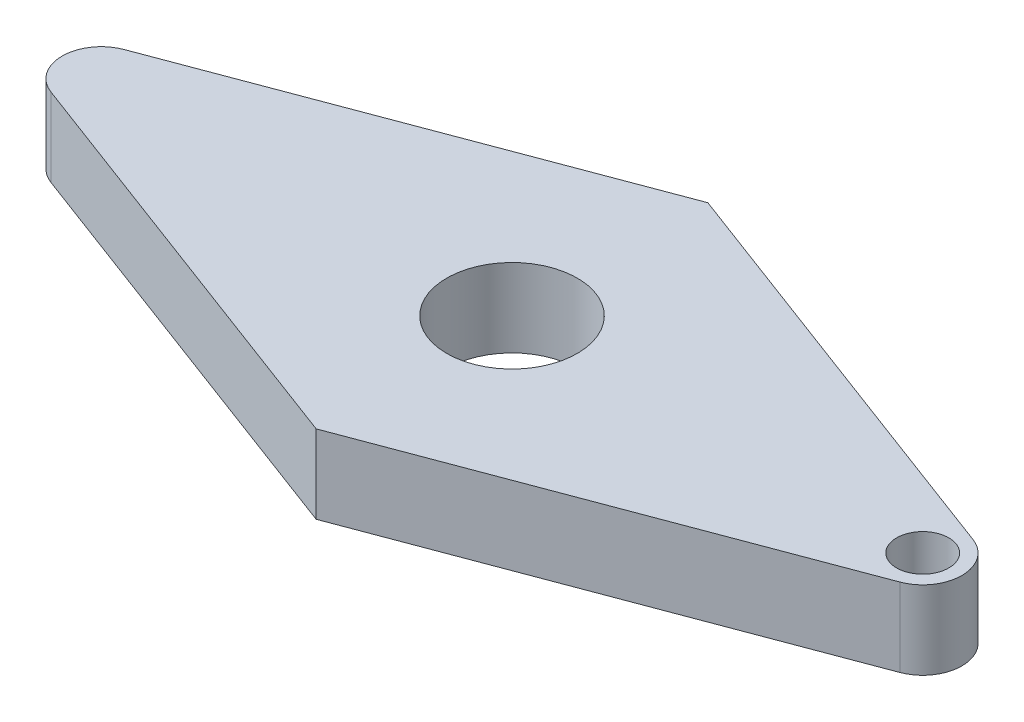
ISO-10303-21;
HEADER;
FILE_DESCRIPTION(('STEP AP214'),'2;1');
FILE_NAME('part.step','',(''),(''),'','','');
FILE_SCHEMA(('AUTOMOTIVE_DESIGN { 1 0 10303 214 1 1 1 1 }'));
ENDSEC;
DATA;
#1=APPLICATION_CONTEXT('core data for automotive mechanical design processes');
#2=APPLICATION_PROTOCOL_DEFINITION('international standard','automotive_design',2000,#1);
#3=PRODUCT_CONTEXT('',#1,'mechanical');
#4=PRODUCT('Part','Part','',(#3));
#5=PRODUCT_RELATED_PRODUCT_CATEGORY('part','',(#4));
#6=PRODUCT_DEFINITION_FORMATION('','',#4);
#7=PRODUCT_DEFINITION_CONTEXT('part definition',#1,'design');
#8=PRODUCT_DEFINITION('design','',#6,#7);
#9=PRODUCT_DEFINITION_SHAPE('','',#8);
#10=(LENGTH_UNIT() NAMED_UNIT(*) SI_UNIT(.MILLI.,.METRE.));
#11=(NAMED_UNIT(*) PLANE_ANGLE_UNIT() SI_UNIT($,.RADIAN.));
#12=(NAMED_UNIT(*) SI_UNIT($,.STERADIAN.) SOLID_ANGLE_UNIT());
#13=UNCERTAINTY_MEASURE_WITH_UNIT(LENGTH_MEASURE(1.E-05),#10,'distance_accuracy_value','');
#14=(GEOMETRIC_REPRESENTATION_CONTEXT(3) GLOBAL_UNCERTAINTY_ASSIGNED_CONTEXT((#13)) GLOBAL_UNIT_ASSIGNED_CONTEXT((#10,
#11,#12)) REPRESENTATION_CONTEXT('',''));
#15=CARTESIAN_POINT('',(0.,0.,0.));
#16=DIRECTION('',(0.,0.,1.));
#17=DIRECTION('',(1.,0.,0.));
#18=AXIS2_PLACEMENT_3D('',#15,#16,#17);
#19=CARTESIAN_POINT('',(-15.7279981273412,3.,0.));
#20=DIRECTION('',(0.,-1.,0.));
#21=DIRECTION('',(0.,0.,-1.));
#22=AXIS2_PLACEMENT_3D('',#19,#20,#21);
#23=PLANE('',#22);
#24=CARTESIAN_POINT('',(15.7279981273412,3.,0.));
#25=DIRECTION('',(0.,1.,0.));
#26=DIRECTION('',(0.,0.,1.));
#27=AXIS2_PLACEMENT_3D('',#24,#25,#26);
#28=CIRCLE('',#27,1.00000000000001);
#29=CARTESIAN_POINT('',(15.7279981273412,3.,1.00000000000001));
#30=VERTEX_POINT('',#29);
#31=EDGE_CURVE('E173',#30,#30,#28,.T.);
#32=ORIENTED_EDGE('',*,*,#31,.F.);
#33=EDGE_LOOP('',(#32));
#34=FACE_BOUND('',#33,.T.);
#35=CARTESIAN_POINT('',(-15.7279981273412,3.,0.));
#36=DIRECTION('',(0.,1.,0.));
#37=DIRECTION('',(0.,0.,-1.));
#38=AXIS2_PLACEMENT_3D('',#35,#36,#37);
#39=CIRCLE('',#38,1.5);
#40=CARTESIAN_POINT('',(-16.2546832897238,3.,-1.40449376635357));
#41=VERTEX_POINT('',#40);
#42=CARTESIAN_POINT('',(-16.2546832897238,3.,1.40449376635357));
#43=VERTEX_POINT('',#42);
#44=EDGE_CURVE('E128',#41,#43,#39,.T.);
#45=ORIENTED_EDGE('',*,*,#44,.T.);
#46=DIRECTION('',(0.936329177569044,0.,0.351123441588392));
#47=VECTOR('',#46,1.);
#48=CARTESIAN_POINT('',(0.,3.,7.5));
#49=LINE('',#48,#47);
#50=CARTESIAN_POINT('',(0.,3.,7.5));
#51=VERTEX_POINT('',#50);
#52=EDGE_CURVE('E86',#43,#51,#49,.T.);
#53=ORIENTED_EDGE('',*,*,#52,.T.);
#54=DIRECTION('',(0.936329177569045,0.,-0.351123441588392));
#55=VECTOR('',#54,1.);
#56=CARTESIAN_POINT('',(16.2546832897238,3.,1.40449376635357));
#57=LINE('',#56,#55);
#58=CARTESIAN_POINT('',(16.2546832897238,3.,1.40449376635357));
#59=VERTEX_POINT('',#58);
#60=EDGE_CURVE('E99',#51,#59,#57,.T.);
#61=ORIENTED_EDGE('',*,*,#60,.T.);
#62=CARTESIAN_POINT('',(15.7279981273412,3.,0.));
#63=DIRECTION('',(0.,1.,0.));
#64=DIRECTION('',(0.,0.,1.));
#65=AXIS2_PLACEMENT_3D('',#62,#63,#64);
#66=CIRCLE('',#65,1.5);
#67=CARTESIAN_POINT('',(16.2546832897238,3.,-1.40449376635357));
#68=VERTEX_POINT('',#67);
#69=EDGE_CURVE('E93',#59,#68,#66,.T.);
#70=ORIENTED_EDGE('',*,*,#69,.T.);
#71=DIRECTION('',(-0.936329177569045,0.,-0.351123441588392));
#72=VECTOR('',#71,1.);
#73=CARTESIAN_POINT('',(0.,3.,-7.5));
#74=LINE('',#73,#72);
#75=CARTESIAN_POINT('',(0.,3.,-7.5));
#76=VERTEX_POINT('',#75);
#77=EDGE_CURVE('E97',#68,#76,#74,.T.);
#78=ORIENTED_EDGE('',*,*,#77,.T.);
#79=DIRECTION('',(-0.936329177569044,0.,0.351123441588392));
#80=VECTOR('',#79,1.);
#81=CARTESIAN_POINT('',(-16.2546832897238,3.,-1.40449376635357));
#82=LINE('',#81,#80);
#83=EDGE_CURVE('E49',#76,#41,#82,.T.);
#84=ORIENTED_EDGE('',*,*,#83,.T.);
#85=EDGE_LOOP('',(#45,#53,#61,#70,#78,#84));
#86=FACE_BOUND('',#85,.T.);
#87=CARTESIAN_POINT('',(0.,3.,0.));
#88=DIRECTION('',(0.,1.,0.));
#89=DIRECTION('',(0.,0.,1.));
#90=AXIS2_PLACEMENT_3D('',#87,#88,#89);
#91=CIRCLE('',#90,2.5);
#92=CARTESIAN_POINT('',(0.,3.,2.5));
#93=VERTEX_POINT('',#92);
#94=EDGE_CURVE('E121',#93,#93,#91,.T.);
#95=ORIENTED_EDGE('',*,*,#94,.F.);
#96=EDGE_LOOP('',(#95));
#97=FACE_BOUND('',#96,.T.);
#98=ADVANCED_FACE('F32',(#34,#86,#97),#23,.F.);
#99=CARTESIAN_POINT('',(-15.7279981273412,0.,0.));
#100=DIRECTION('',(0.,-1.,0.));
#101=DIRECTION('',(0.,0.,-1.));
#102=AXIS2_PLACEMENT_3D('',#99,#100,#101);
#103=PLANE('',#102);
#104=CARTESIAN_POINT('',(15.7279981273412,0.,0.));
#105=DIRECTION('',(0.,1.,0.));
#106=DIRECTION('',(0.,0.,1.));
#107=AXIS2_PLACEMENT_3D('',#104,#105,#106);
#108=CIRCLE('',#107,1.00000000000001);
#109=CARTESIAN_POINT('',(15.7279981273412,0.,1.00000000000001));
#110=VERTEX_POINT('',#109);
#111=EDGE_CURVE('E171',#110,#110,#108,.T.);
#112=ORIENTED_EDGE('',*,*,#111,.T.);
#113=EDGE_LOOP('',(#112));
#114=FACE_BOUND('',#113,.T.);
#115=CARTESIAN_POINT('',(-15.7279981273412,0.,0.));
#116=DIRECTION('',(0.,1.,0.));
#117=DIRECTION('',(0.,0.,-1.));
#118=AXIS2_PLACEMENT_3D('',#115,#116,#117);
#119=CIRCLE('',#118,1.5);
#120=CARTESIAN_POINT('',(-16.2546832897238,0.,-1.40449376635357));
#121=VERTEX_POINT('',#120);
#122=CARTESIAN_POINT('',(-16.2546832897238,0.,1.40449376635357));
#123=VERTEX_POINT('',#122);
#124=EDGE_CURVE('E117',#121,#123,#119,.T.);
#125=ORIENTED_EDGE('',*,*,#124,.F.);
#126=DIRECTION('',(-0.936329177569044,0.,0.351123441588392));
#127=VECTOR('',#126,1.);
#128=CARTESIAN_POINT('',(-16.2546832897238,0.,-1.40449376635357));
#129=LINE('',#128,#127);
#130=CARTESIAN_POINT('',(0.,0.,-7.5));
#131=VERTEX_POINT('',#130);
#132=EDGE_CURVE('E78',#131,#121,#129,.T.);
#133=ORIENTED_EDGE('',*,*,#132,.F.);
#134=DIRECTION('',(-0.936329177569045,0.,-0.351123441588392));
#135=VECTOR('',#134,1.);
#136=CARTESIAN_POINT('',(0.,0.,-7.5));
#137=LINE('',#136,#135);
#138=CARTESIAN_POINT('',(16.2546832897238,0.,-1.40449376635357));
#139=VERTEX_POINT('',#138);
#140=EDGE_CURVE('E72',#139,#131,#137,.T.);
#141=ORIENTED_EDGE('',*,*,#140,.F.);
#142=CARTESIAN_POINT('',(15.7279981273412,0.,0.));
#143=DIRECTION('',(0.,1.,0.));
#144=DIRECTION('',(0.,0.,1.));
#145=AXIS2_PLACEMENT_3D('',#142,#143,#144);
#146=CIRCLE('',#145,1.5);
#147=CARTESIAN_POINT('',(16.2546832897238,0.,1.40449376635357));
#148=VERTEX_POINT('',#147);
#149=EDGE_CURVE('E107',#148,#139,#146,.T.);
#150=ORIENTED_EDGE('',*,*,#149,.F.);
#151=DIRECTION('',(0.936329177569045,0.,-0.351123441588392));
#152=VECTOR('',#151,1.);
#153=CARTESIAN_POINT('',(16.2546832897238,0.,1.40449376635357));
#154=LINE('',#153,#152);
#155=CARTESIAN_POINT('',(0.,0.,7.5));
#156=VERTEX_POINT('',#155);
#157=EDGE_CURVE('E123',#156,#148,#154,.T.);
#158=ORIENTED_EDGE('',*,*,#157,.F.);
#159=DIRECTION('',(0.936329177569044,0.,0.351123441588392));
#160=VECTOR('',#159,1.);
#161=CARTESIAN_POINT('',(0.,0.,7.5));
#162=LINE('',#161,#160);
#163=EDGE_CURVE('E120',#123,#156,#162,.T.);
#164=ORIENTED_EDGE('',*,*,#163,.F.);
#165=EDGE_LOOP('',(#125,#133,#141,#150,#158,#164));
#166=FACE_BOUND('',#165,.T.);
#167=CARTESIAN_POINT('',(0.,0.,0.));
#168=DIRECTION('',(0.,1.,0.));
#169=DIRECTION('',(0.,0.,1.));
#170=AXIS2_PLACEMENT_3D('',#167,#168,#169);
#171=CIRCLE('',#170,2.5);
#172=CARTESIAN_POINT('',(0.,0.,2.5));
#173=VERTEX_POINT('',#172);
#174=EDGE_CURVE('E175',#173,#173,#171,.T.);
#175=ORIENTED_EDGE('',*,*,#174,.T.);
#176=EDGE_LOOP('',(#175));
#177=FACE_BOUND('',#176,.T.);
#178=ADVANCED_FACE('F137',(#114,#166,#177),#103,.T.);
#179=CARTESIAN_POINT('',(-15.7279981273412,3.,0.));
#180=DIRECTION('',(0.,-1.,0.));
#181=DIRECTION('',(0.,0.,-1.));
#182=AXIS2_PLACEMENT_3D('',#179,#180,#181);
#183=CYLINDRICAL_SURFACE('',#182,1.5);
#184=ORIENTED_EDGE('',*,*,#124,.T.);
#185=DIRECTION('',(0.,-1.,0.));
#186=VECTOR('',#185,1.);
#187=CARTESIAN_POINT('',(-16.2546832897238,3.,1.40449376635357));
#188=LINE('',#187,#186);
#189=EDGE_CURVE('E11',#43,#123,#188,.T.);
#190=ORIENTED_EDGE('',*,*,#189,.F.);
#191=ORIENTED_EDGE('',*,*,#44,.F.);
#192=DIRECTION('',(0.,-1.,0.));
#193=VECTOR('',#192,1.);
#194=CARTESIAN_POINT('',(-16.2546832897238,3.,-1.40449376635357));
#195=LINE('',#194,#193);
#196=EDGE_CURVE('E113',#41,#121,#195,.T.);
#197=ORIENTED_EDGE('',*,*,#196,.T.);
#198=EDGE_LOOP('',(#184,#190,#191,#197));
#199=FACE_BOUND('',#198,.T.);
#200=ADVANCED_FACE('F34',(#199),#183,.T.);
#201=CARTESIAN_POINT('',(0.,3.,7.5));
#202=DIRECTION('',(0.351123441588392,0.,-0.936329177569044));
#203=DIRECTION('',(-0.936329177569045,0.,-0.351123441588392));
#204=AXIS2_PLACEMENT_3D('',#201,#202,#203);
#205=PLANE('',#204);
#206=ORIENTED_EDGE('',*,*,#163,.T.);
#207=DIRECTION('',(0.,-1.,0.));
#208=VECTOR('',#207,1.);
#209=CARTESIAN_POINT('',(0.,3.,7.5));
#210=LINE('',#209,#208);
#211=EDGE_CURVE('E41',#51,#156,#210,.T.);
#212=ORIENTED_EDGE('',*,*,#211,.F.);
#213=ORIENTED_EDGE('',*,*,#52,.F.);
#214=ORIENTED_EDGE('',*,*,#189,.T.);
#215=EDGE_LOOP('',(#206,#212,#213,#214));
#216=FACE_BOUND('',#215,.T.);
#217=ADVANCED_FACE('F212',(#216),#205,.F.);
#218=CARTESIAN_POINT('',(16.2546832897238,3.,1.40449376635357));
#219=DIRECTION('',(-0.351123441588392,0.,-0.936329177569044));
#220=DIRECTION('',(-0.936329177569045,0.,0.351123441588392));
#221=AXIS2_PLACEMENT_3D('',#218,#219,#220);
#222=PLANE('',#221);
#223=ORIENTED_EDGE('',*,*,#157,.T.);
#224=DIRECTION('',(0.,-1.,0.));
#225=VECTOR('',#224,1.);
#226=CARTESIAN_POINT('',(16.2546832897238,3.,1.40449376635357));
#227=LINE('',#226,#225);
#228=EDGE_CURVE('E108',#59,#148,#227,.T.);
#229=ORIENTED_EDGE('',*,*,#228,.F.);
#230=ORIENTED_EDGE('',*,*,#60,.F.);
#231=ORIENTED_EDGE('',*,*,#211,.T.);
#232=EDGE_LOOP('',(#223,#229,#230,#231));
#233=FACE_BOUND('',#232,.T.);
#234=ADVANCED_FACE('F134',(#233),#222,.F.);
#235=CARTESIAN_POINT('',(15.7279981273412,3.,0.));
#236=DIRECTION('',(0.,-1.,0.));
#237=DIRECTION('',(0.,0.,-1.));
#238=AXIS2_PLACEMENT_3D('',#235,#236,#237);
#239=CYLINDRICAL_SURFACE('',#238,1.5);
#240=ORIENTED_EDGE('',*,*,#149,.T.);
#241=DIRECTION('',(0.,-1.,0.));
#242=VECTOR('',#241,1.);
#243=CARTESIAN_POINT('',(16.2546832897238,3.,-1.40449376635357));
#244=LINE('',#243,#242);
#245=EDGE_CURVE('E104',#68,#139,#244,.T.);
#246=ORIENTED_EDGE('',*,*,#245,.F.);
#247=ORIENTED_EDGE('',*,*,#69,.F.);
#248=ORIENTED_EDGE('',*,*,#228,.T.);
#249=EDGE_LOOP('',(#240,#246,#247,#248));
#250=FACE_BOUND('',#249,.T.);
#251=ADVANCED_FACE('F105',(#250),#239,.T.);
#252=CARTESIAN_POINT('',(0.,3.,-7.5));
#253=DIRECTION('',(-0.351123441588392,0.,0.936329177569044));
#254=DIRECTION('',(0.936329177569045,0.,0.351123441588392));
#255=AXIS2_PLACEMENT_3D('',#252,#253,#254);
#256=PLANE('',#255);
#257=ORIENTED_EDGE('',*,*,#140,.T.);
#258=DIRECTION('',(0.,-1.,0.));
#259=VECTOR('',#258,1.);
#260=CARTESIAN_POINT('',(0.,3.,-7.5));
#261=LINE('',#260,#259);
#262=EDGE_CURVE('E109',#76,#131,#261,.T.);
#263=ORIENTED_EDGE('',*,*,#262,.F.);
#264=ORIENTED_EDGE('',*,*,#77,.F.);
#265=ORIENTED_EDGE('',*,*,#245,.T.);
#266=EDGE_LOOP('',(#257,#263,#264,#265));
#267=FACE_BOUND('',#266,.T.);
#268=ADVANCED_FACE('F111',(#267),#256,.F.);
#269=CARTESIAN_POINT('',(-16.2546832897238,3.,-1.40449376635357));
#270=DIRECTION('',(0.351123441588392,0.,0.936329177569044));
#271=DIRECTION('',(0.936329177569045,0.,-0.351123441588392));
#272=AXIS2_PLACEMENT_3D('',#269,#270,#271);
#273=PLANE('',#272);
#274=ORIENTED_EDGE('',*,*,#132,.T.);
#275=ORIENTED_EDGE('',*,*,#196,.F.);
#276=ORIENTED_EDGE('',*,*,#83,.F.);
#277=ORIENTED_EDGE('',*,*,#262,.T.);
#278=EDGE_LOOP('',(#274,#275,#276,#277));
#279=FACE_BOUND('',#278,.T.);
#280=ADVANCED_FACE('F142',(#279),#273,.F.);
#281=CARTESIAN_POINT('',(0.,3.,0.));
#282=DIRECTION('',(0.,-1.,0.));
#283=DIRECTION('',(0.,0.,-1.));
#284=AXIS2_PLACEMENT_3D('',#281,#282,#283);
#285=CYLINDRICAL_SURFACE('',#284,2.5);
#286=ORIENTED_EDGE('',*,*,#94,.T.);
#287=EDGE_LOOP('',(#286));
#288=FACE_BOUND('',#287,.T.);
#289=ORIENTED_EDGE('',*,*,#174,.F.);
#290=EDGE_LOOP('',(#289));
#291=FACE_BOUND('',#290,.T.);
#292=ADVANCED_FACE('F144',(#288,#291),#285,.F.);
#293=CARTESIAN_POINT('',(15.7279981273412,0.,0.));
#294=DIRECTION('',(0.,1.,0.));
#295=DIRECTION('',(0.,0.,1.));
#296=AXIS2_PLACEMENT_3D('',#293,#294,#295);
#297=CYLINDRICAL_SURFACE('',#296,1.00000000000001);
#298=ORIENTED_EDGE('',*,*,#111,.F.);
#299=EDGE_LOOP('',(#298));
#300=FACE_BOUND('',#299,.T.);
#301=ORIENTED_EDGE('',*,*,#31,.T.);
#302=EDGE_LOOP('',(#301));
#303=FACE_BOUND('',#302,.T.);
#304=ADVANCED_FACE('F150',(#300,#303),#297,.F.);
#305=CLOSED_SHELL('',(#98,#178,#200,#217,#234,#251,#268,#280,#292,#304));
#306=MANIFOLD_SOLID_BREP('B2',#305);
#307=ADVANCED_BREP_SHAPE_REPRESENTATION('',(#18,#306),#14);
#308=SHAPE_DEFINITION_REPRESENTATION(#9,#307);
ENDSEC;
END-ISO-10303-21;
